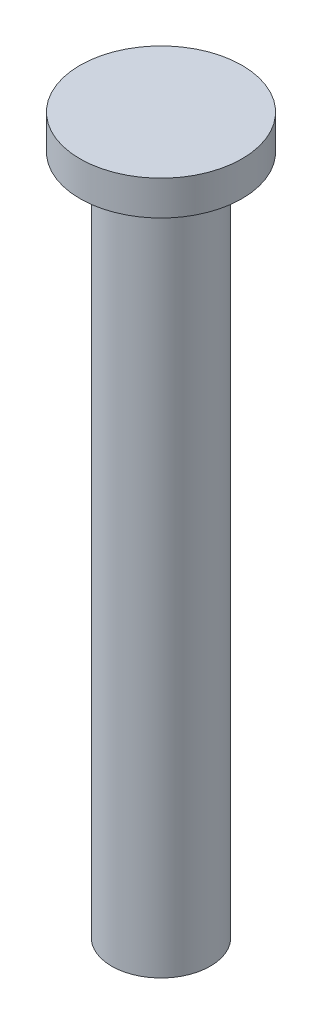
ISO-10303-21;
HEADER;
FILE_DESCRIPTION(('STEP AP214'),'2;1');
FILE_NAME('part.step','',(''),(''),'','','');
FILE_SCHEMA(('AUTOMOTIVE_DESIGN { 1 0 10303 214 1 1 1 1 }'));
ENDSEC;
DATA;
#1=APPLICATION_CONTEXT('core data for automotive mechanical design processes');
#2=APPLICATION_PROTOCOL_DEFINITION('international standard','automotive_design',2000,#1);
#3=PRODUCT_CONTEXT('',#1,'mechanical');
#4=PRODUCT('Part','Part','',(#3));
#5=PRODUCT_RELATED_PRODUCT_CATEGORY('part','',(#4));
#6=PRODUCT_DEFINITION_FORMATION('','',#4);
#7=PRODUCT_DEFINITION_CONTEXT('part definition',#1,'design');
#8=PRODUCT_DEFINITION('design','',#6,#7);
#9=PRODUCT_DEFINITION_SHAPE('','',#8);
#10=(LENGTH_UNIT() NAMED_UNIT(*) SI_UNIT(.MILLI.,.METRE.));
#11=(NAMED_UNIT(*) PLANE_ANGLE_UNIT() SI_UNIT($,.RADIAN.));
#12=(NAMED_UNIT(*) SI_UNIT($,.STERADIAN.) SOLID_ANGLE_UNIT());
#13=UNCERTAINTY_MEASURE_WITH_UNIT(LENGTH_MEASURE(1.E-05),#10,'distance_accuracy_value','');
#14=(GEOMETRIC_REPRESENTATION_CONTEXT(3) GLOBAL_UNCERTAINTY_ASSIGNED_CONTEXT((#13)) GLOBAL_UNIT_ASSIGNED_CONTEXT((#10,
#11,#12)) REPRESENTATION_CONTEXT('',''));
#15=CARTESIAN_POINT('',(0.,0.,0.));
#16=DIRECTION('',(0.,0.,1.));
#17=DIRECTION('',(1.,0.,0.));
#18=AXIS2_PLACEMENT_3D('',#15,#16,#17);
#19=CARTESIAN_POINT('',(0.,-138.,0.));
#20=DIRECTION('',(0.,1.,0.));
#21=DIRECTION('',(0.,0.,1.));
#22=AXIS2_PLACEMENT_3D('',#19,#20,#21);
#23=CYLINDRICAL_SURFACE('',#22,10.);
#24=CARTESIAN_POINT('',(0.,-138.,0.));
#25=DIRECTION('',(0.,1.,0.));
#26=DIRECTION('',(0.,0.,1.));
#27=AXIS2_PLACEMENT_3D('',#24,#25,#26);
#28=CIRCLE('',#27,10.);
#29=CARTESIAN_POINT('',(0.,-138.,10.));
#30=VERTEX_POINT('',#29);
#31=EDGE_CURVE('E10',#30,#30,#28,.T.);
#32=ORIENTED_EDGE('',*,*,#31,.T.);
#33=EDGE_LOOP('',(#32));
#34=FACE_BOUND('',#33,.T.);
#35=CARTESIAN_POINT('',(0.,0.,0.));
#36=DIRECTION('',(0.,1.,0.));
#37=DIRECTION('',(0.,0.,1.));
#38=AXIS2_PLACEMENT_3D('',#35,#36,#37);
#39=CIRCLE('',#38,10.);
#40=CARTESIAN_POINT('',(0.,0.,10.));
#41=VERTEX_POINT('',#40);
#42=EDGE_CURVE('E34',#41,#41,#39,.T.);
#43=ORIENTED_EDGE('',*,*,#42,.F.);
#44=EDGE_LOOP('',(#43));
#45=FACE_BOUND('',#44,.T.);
#46=ADVANCED_FACE('F31',(#34,#45),#23,.T.);
#47=CARTESIAN_POINT('',(0.,-138.,0.));
#48=DIRECTION('',(0.,1.,0.));
#49=DIRECTION('',(0.,0.,1.));
#50=AXIS2_PLACEMENT_3D('',#47,#48,#49);
#51=PLANE('',#50);
#52=ORIENTED_EDGE('',*,*,#31,.F.);
#53=EDGE_LOOP('',(#52));
#54=FACE_BOUND('',#53,.T.);
#55=ADVANCED_FACE('F54',(#54),#51,.F.);
#56=CARTESIAN_POINT('',(0.,7.,0.));
#57=DIRECTION('',(0.,-1.,0.));
#58=DIRECTION('',(0.,0.,-1.));
#59=AXIS2_PLACEMENT_3D('',#56,#57,#58);
#60=CYLINDRICAL_SURFACE('',#59,16.4313745920715);
#61=CARTESIAN_POINT('',(0.,7.,0.));
#62=DIRECTION('',(0.,1.,0.));
#63=DIRECTION('',(0.,0.,1.));
#64=AXIS2_PLACEMENT_3D('',#61,#62,#63);
#65=CIRCLE('',#64,16.4313745920715);
#66=CARTESIAN_POINT('',(0.,7.,-16.4313745920715));
#67=VERTEX_POINT('',#66);
#68=EDGE_CURVE('E41',#67,#67,#65,.T.);
#69=CARTESIAN_POINT('',(0.,0.,0.));
#70=DIRECTION('',(0.,1.,0.));
#71=DIRECTION('',(0.,0.,1.));
#72=AXIS2_PLACEMENT_3D('',#69,#70,#71);
#73=CIRCLE('',#72,16.4313745920715);
#74=CARTESIAN_POINT('',(0.,0.,-16.4313745920715));
#75=VERTEX_POINT('',#74);
#76=EDGE_CURVE('E43',#75,#75,#73,.T.);
#77=CARTESIAN_POINT('',(0.,7.,-16.4313745920715));
#78=CARTESIAN_POINT('',(0.,6.92708333333333,-16.4313745920715));
#79=CARTESIAN_POINT('',(0.,6.85416666666667,-16.4313745920715));
#80=CARTESIAN_POINT('',(0.,6.70833333333333,-16.4313745920715));
#81=CARTESIAN_POINT('',(0.,6.63541666666667,-16.4313745920715));
#82=CARTESIAN_POINT('',(0.,6.48958333333333,-16.4313745920715));
#83=CARTESIAN_POINT('',(0.,6.41666666666667,-16.4313745920715));
#84=CARTESIAN_POINT('',(0.,6.27083333333333,-16.4313745920715));
#85=CARTESIAN_POINT('',(0.,6.19791666666667,-16.4313745920715));
#86=CARTESIAN_POINT('',(0.,6.05208333333333,-16.4313745920715));
#87=CARTESIAN_POINT('',(0.,5.97916666666667,-16.4313745920715));
#88=CARTESIAN_POINT('',(0.,5.83333333333333,-16.4313745920715));
#89=CARTESIAN_POINT('',(0.,5.76041666666667,-16.4313745920715));
#90=CARTESIAN_POINT('',(0.,5.61458333333333,-16.4313745920715));
#91=CARTESIAN_POINT('',(0.,5.54166666666667,-16.4313745920715));
#92=CARTESIAN_POINT('',(0.,5.39583333333333,-16.4313745920715));
#93=CARTESIAN_POINT('',(0.,5.32291666666667,-16.4313745920715));
#94=CARTESIAN_POINT('',(0.,5.17708333333333,-16.4313745920715));
#95=CARTESIAN_POINT('',(0.,5.10416666666667,-16.4313745920715));
#96=CARTESIAN_POINT('',(0.,4.95833333333333,-16.4313745920715));
#97=CARTESIAN_POINT('',(0.,4.88541666666667,-16.4313745920715));
#98=CARTESIAN_POINT('',(0.,4.73958333333333,-16.4313745920715));
#99=CARTESIAN_POINT('',(0.,4.66666666666667,-16.4313745920715));
#100=CARTESIAN_POINT('',(0.,4.52083333333333,-16.4313745920715));
#101=CARTESIAN_POINT('',(0.,4.44791666666667,-16.4313745920715));
#102=CARTESIAN_POINT('',(0.,4.30208333333333,-16.4313745920715));
#103=CARTESIAN_POINT('',(0.,4.22916666666667,-16.4313745920715));
#104=CARTESIAN_POINT('',(0.,4.08333333333333,-16.4313745920715));
#105=CARTESIAN_POINT('',(0.,4.01041666666666,-16.4313745920715));
#106=CARTESIAN_POINT('',(0.,3.86458333333333,-16.4313745920715));
#107=CARTESIAN_POINT('',(0.,3.79166666666667,-16.4313745920715));
#108=CARTESIAN_POINT('',(0.,3.64583333333333,-16.4313745920715));
#109=CARTESIAN_POINT('',(0.,3.57291666666667,-16.4313745920715));
#110=CARTESIAN_POINT('',(0.,3.42708333333333,-16.4313745920715));
#111=CARTESIAN_POINT('',(0.,3.35416666666667,-16.4313745920715));
#112=CARTESIAN_POINT('',(0.,3.20833333333333,-16.4313745920715));
#113=CARTESIAN_POINT('',(0.,3.13541666666667,-16.4313745920715));
#114=CARTESIAN_POINT('',(0.,2.98958333333333,-16.4313745920715));
#115=CARTESIAN_POINT('',(0.,2.91666666666667,-16.4313745920715));
#116=CARTESIAN_POINT('',(0.,2.77083333333333,-16.4313745920715));
#117=CARTESIAN_POINT('',(0.,2.69791666666667,-16.4313745920715));
#118=CARTESIAN_POINT('',(0.,2.55208333333333,-16.4313745920715));
#119=CARTESIAN_POINT('',(0.,2.47916666666667,-16.4313745920715));
#120=CARTESIAN_POINT('',(0.,2.33333333333333,-16.4313745920715));
#121=CARTESIAN_POINT('',(0.,2.26041666666667,-16.4313745920715));
#122=CARTESIAN_POINT('',(0.,2.11458333333333,-16.4313745920715));
#123=CARTESIAN_POINT('',(0.,2.04166666666667,-16.4313745920715));
#124=CARTESIAN_POINT('',(0.,1.89583333333333,-16.4313745920715));
#125=CARTESIAN_POINT('',(0.,1.82291666666667,-16.4313745920715));
#126=CARTESIAN_POINT('',(0.,1.67708333333333,-16.4313745920715));
#127=CARTESIAN_POINT('',(0.,1.60416666666667,-16.4313745920715));
#128=CARTESIAN_POINT('',(0.,1.45833333333333,-16.4313745920715));
#129=CARTESIAN_POINT('',(0.,1.38541666666667,-16.4313745920715));
#130=CARTESIAN_POINT('',(0.,1.23958333333333,-16.4313745920715));
#131=CARTESIAN_POINT('',(0.,1.16666666666667,-16.4313745920715));
#132=CARTESIAN_POINT('',(0.,1.02083333333333,-16.4313745920715));
#133=CARTESIAN_POINT('',(0.,0.947916666666666,-16.4313745920715));
#134=CARTESIAN_POINT('',(0.,0.802083333333332,-16.4313745920715));
#135=CARTESIAN_POINT('',(0.,0.729166666666666,-16.4313745920715));
#136=CARTESIAN_POINT('',(0.,0.583333333333332,-16.4313745920715));
#137=CARTESIAN_POINT('',(0.,0.510416666666666,-16.4313745920715));
#138=CARTESIAN_POINT('',(0.,0.364583333333333,-16.4313745920715));
#139=CARTESIAN_POINT('',(0.,0.291666666666666,-16.4313745920715));
#140=CARTESIAN_POINT('',(0.,0.145833333333333,-16.4313745920715));
#141=CARTESIAN_POINT('',(0.,0.0729166666666657,-16.4313745920715));
#142=CARTESIAN_POINT('',(0.,0.,-16.4313745920715));
#143=B_SPLINE_CURVE_WITH_KNOTS('',3,(#77,#78,#79,#80,#81,#82,#83,#84,#85,#86,#87,#88,#89,#90,
#91,#92,#93,#94,#95,#96,#97,#98,#99,#100,#101,#102,#103,#104,#105,#106,#107,#108,#109,#110,#111,
#112,#113,#114,#115,#116,#117,#118,#119,#120,#121,#122,#123,#124,#125,#126,#127,#128,#129,#130,
#131,#132,#133,#134,#135,#136,#137,#138,#139,#140,#141,#142),.UNSPECIFIED.,.F.,.F.,(4,2,2,2,2,2,
2,2,2,2,2,2,2,2,2,2,2,2,2,2,2,2,2,2,2,2,2,2,2,2,2,2,4),(0.,0.21875,0.4375,0.656250000000001,
0.875000000000001,1.09375,1.3125,1.53125,1.75,1.96875,2.1875,2.40625,2.625,2.84375,3.0625,
3.28125,3.5,3.71875,3.9375,4.15625,4.375,4.59375,4.8125,5.03125,5.25,5.46875,5.6875,5.90625,
6.125,6.34375,6.5625,6.78125,7.),.UNSPECIFIED.);
#144=EDGE_CURVE('BSEAM51',#67,#75,#143,.T.);
#145=ORIENTED_EDGE('',*,*,#68,.F.);
#146=ORIENTED_EDGE('',*,*,#76,.T.);
#147=ORIENTED_EDGE('',*,*,#144,.T.);
#148=ORIENTED_EDGE('',*,*,#144,.F.);
#149=EDGE_LOOP('',(#145,#147,#146,#148));
#150=FACE_BOUND('',#149,.T.);
#151=ADVANCED_FACE('F51',(#150),#60,.T.);
#152=CARTESIAN_POINT('',(0.,7.,0.));
#153=DIRECTION('',(0.,1.,0.));
#154=DIRECTION('',(0.,0.,1.));
#155=AXIS2_PLACEMENT_3D('',#152,#153,#154);
#156=PLANE('',#155);
#157=ORIENTED_EDGE('',*,*,#68,.T.);
#158=EDGE_LOOP('',(#157));
#159=FACE_BOUND('',#158,.T.);
#160=ADVANCED_FACE('F49',(#159),#156,.T.);
#161=CARTESIAN_POINT('',(0.,0.,0.));
#162=DIRECTION('',(0.,1.,0.));
#163=DIRECTION('',(0.,0.,1.));
#164=AXIS2_PLACEMENT_3D('',#161,#162,#163);
#165=PLANE('',#164);
#166=ORIENTED_EDGE('',*,*,#42,.T.);
#167=EDGE_LOOP('',(#166));
#168=FACE_BOUND('',#167,.T.);
#169=ORIENTED_EDGE('',*,*,#76,.F.);
#170=EDGE_LOOP('',(#169));
#171=FACE_BOUND('',#170,.T.);
#172=ADVANCED_FACE('F58',(#168,#171),#165,.F.);
#173=CLOSED_SHELL('',(#46,#55,#151,#160,#172));
#174=MANIFOLD_SOLID_BREP('B2',#173);
#175=ADVANCED_BREP_SHAPE_REPRESENTATION('',(#18,#174),#14);
#176=SHAPE_DEFINITION_REPRESENTATION(#9,#175);
ENDSEC;
END-ISO-10303-21;
